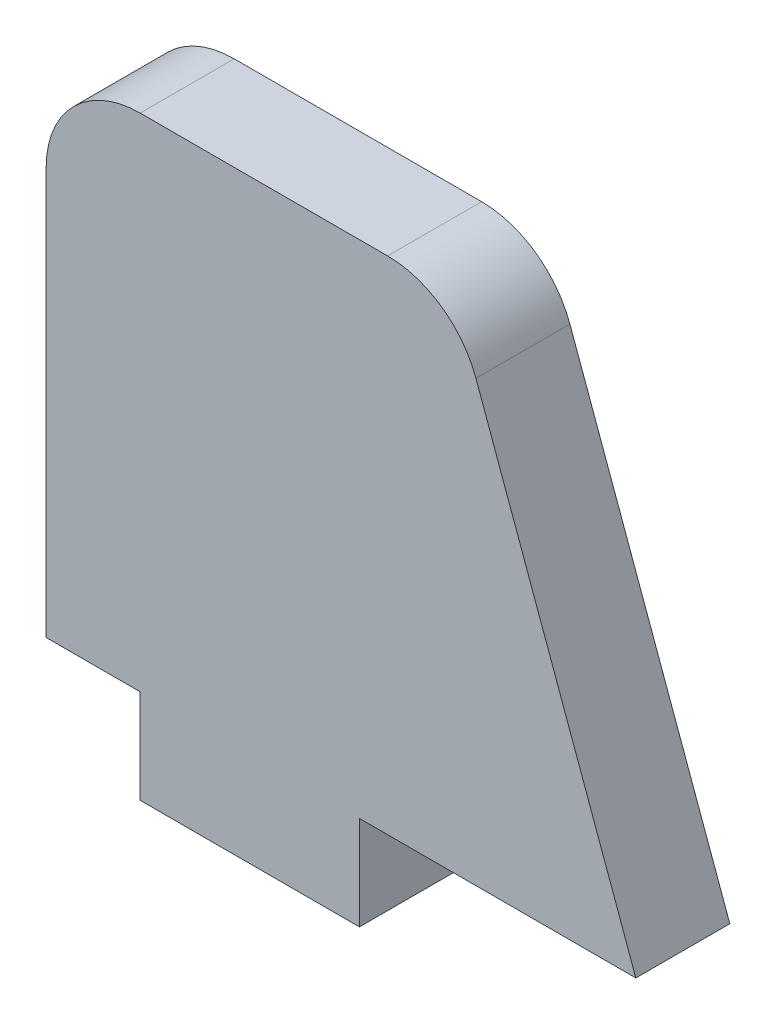
ISO-10303-21;
HEADER;
FILE_DESCRIPTION(('STEP AP214'),'2;1');
FILE_NAME('part.step','',(''),(''),'','','');
FILE_SCHEMA(('AUTOMOTIVE_DESIGN { 1 0 10303 214 1 1 1 1 }'));
ENDSEC;
DATA;
#1=APPLICATION_CONTEXT('core data for automotive mechanical design processes');
#2=APPLICATION_PROTOCOL_DEFINITION('international standard','automotive_design',2000,#1);
#3=PRODUCT_CONTEXT('',#1,'mechanical');
#4=PRODUCT('Part','Part','',(#3));
#5=PRODUCT_RELATED_PRODUCT_CATEGORY('part','',(#4));
#6=PRODUCT_DEFINITION_FORMATION('','',#4);
#7=PRODUCT_DEFINITION_CONTEXT('part definition',#1,'design');
#8=PRODUCT_DEFINITION('design','',#6,#7);
#9=PRODUCT_DEFINITION_SHAPE('','',#8);
#10=(LENGTH_UNIT() NAMED_UNIT(*) SI_UNIT(.MILLI.,.METRE.));
#11=(NAMED_UNIT(*) PLANE_ANGLE_UNIT() SI_UNIT($,.RADIAN.));
#12=(NAMED_UNIT(*) SI_UNIT($,.STERADIAN.) SOLID_ANGLE_UNIT());
#13=UNCERTAINTY_MEASURE_WITH_UNIT(LENGTH_MEASURE(1.E-05),#10,'distance_accuracy_value','');
#14=(GEOMETRIC_REPRESENTATION_CONTEXT(3) GLOBAL_UNCERTAINTY_ASSIGNED_CONTEXT((#13)) GLOBAL_UNIT_ASSIGNED_CONTEXT((#10,
#11,#12)) REPRESENTATION_CONTEXT('',''));
#15=CARTESIAN_POINT('',(0.,0.,0.));
#16=DIRECTION('',(0.,0.,1.));
#17=DIRECTION('',(1.,0.,0.));
#18=AXIS2_PLACEMENT_3D('',#15,#16,#17);
#19=CARTESIAN_POINT('',(-3.5,-8.,1.5));
#20=DIRECTION('',(0.,1.,0.));
#21=DIRECTION('',(-1.,0.,0.));
#22=AXIS2_PLACEMENT_3D('',#19,#20,#21);
#23=PLANE('',#22);
#24=DIRECTION('',(1.,0.,0.));
#25=VECTOR('',#24,1.);
#26=CARTESIAN_POINT('',(-3.5,-8.,-1.5));
#27=LINE('',#26,#25);
#28=CARTESIAN_POINT('',(-6.5,-8.,-1.5));
#29=VERTEX_POINT('',#28);
#30=CARTESIAN_POINT('',(-3.5,-8.,-1.5));
#31=VERTEX_POINT('',#30);
#32=EDGE_CURVE('E149',#29,#31,#27,.T.);
#33=ORIENTED_EDGE('',*,*,#32,.T.);
#34=DIRECTION('',(0.,0.,-1.));
#35=VECTOR('',#34,1.);
#36=CARTESIAN_POINT('',(-3.5,-8.,1.5));
#37=LINE('',#36,#35);
#38=CARTESIAN_POINT('',(-3.5,-8.,1.5));
#39=VERTEX_POINT('',#38);
#40=EDGE_CURVE('E130',#39,#31,#37,.T.);
#41=ORIENTED_EDGE('',*,*,#40,.F.);
#42=DIRECTION('',(1.,0.,0.));
#43=VECTOR('',#42,1.);
#44=CARTESIAN_POINT('',(-3.5,-8.,1.5));
#45=LINE('',#44,#43);
#46=CARTESIAN_POINT('',(-6.5,-8.,1.5));
#47=VERTEX_POINT('',#46);
#48=EDGE_CURVE('E137',#47,#39,#45,.T.);
#49=ORIENTED_EDGE('',*,*,#48,.F.);
#50=DIRECTION('',(0.,0.,-1.));
#51=VECTOR('',#50,1.);
#52=CARTESIAN_POINT('',(-6.5,-8.,1.5));
#53=LINE('',#52,#51);
#54=EDGE_CURVE('E210',#47,#29,#53,.T.);
#55=ORIENTED_EDGE('',*,*,#54,.T.);
#56=EDGE_LOOP('',(#33,#41,#49,#55));
#57=FACE_BOUND('',#56,.T.);
#58=ADVANCED_FACE('F45',(#57),#23,.F.);
#59=CARTESIAN_POINT('',(-3.5,-8.,1.5));
#60=DIRECTION('',(1.,0.,0.));
#61=DIRECTION('',(0.,1.,0.));
#62=AXIS2_PLACEMENT_3D('',#59,#60,#61);
#63=PLANE('',#62);
#64=DIRECTION('',(0.,-1.,0.));
#65=VECTOR('',#64,1.);
#66=CARTESIAN_POINT('',(-3.5,-8.,-1.5));
#67=LINE('',#66,#65);
#68=CARTESIAN_POINT('',(-3.5,-11.,-1.5));
#69=VERTEX_POINT('',#68);
#70=EDGE_CURVE('E232',#31,#69,#67,.T.);
#71=ORIENTED_EDGE('',*,*,#70,.T.);
#72=DIRECTION('',(0.,0.,-1.));
#73=VECTOR('',#72,1.);
#74=CARTESIAN_POINT('',(-3.5,-11.,1.5));
#75=LINE('',#74,#73);
#76=CARTESIAN_POINT('',(-3.5,-11.,1.5));
#77=VERTEX_POINT('',#76);
#78=EDGE_CURVE('E133',#77,#69,#75,.T.);
#79=ORIENTED_EDGE('',*,*,#78,.F.);
#80=DIRECTION('',(0.,-1.,0.));
#81=VECTOR('',#80,1.);
#82=CARTESIAN_POINT('',(-3.5,-8.,1.5));
#83=LINE('',#82,#81);
#84=EDGE_CURVE('E126',#39,#77,#83,.T.);
#85=ORIENTED_EDGE('',*,*,#84,.F.);
#86=ORIENTED_EDGE('',*,*,#40,.T.);
#87=EDGE_LOOP('',(#71,#79,#85,#86));
#88=FACE_BOUND('',#87,.T.);
#89=ADVANCED_FACE('F128',(#88),#63,.F.);
#90=CARTESIAN_POINT('',(-3.5,-11.,1.5));
#91=DIRECTION('',(0.,1.,0.));
#92=DIRECTION('',(0.,0.,1.));
#93=AXIS2_PLACEMENT_3D('',#90,#91,#92);
#94=PLANE('',#93);
#95=DIRECTION('',(1.,0.,0.));
#96=VECTOR('',#95,1.);
#97=CARTESIAN_POINT('',(-3.5,-11.,-1.5));
#98=LINE('',#97,#96);
#99=CARTESIAN_POINT('',(3.5,-11.,-1.5));
#100=VERTEX_POINT('',#99);
#101=EDGE_CURVE('E229',#69,#100,#98,.T.);
#102=ORIENTED_EDGE('',*,*,#101,.T.);
#103=DIRECTION('',(0.,0.,-1.));
#104=VECTOR('',#103,1.);
#105=CARTESIAN_POINT('',(3.5,-11.,1.5));
#106=LINE('',#105,#104);
#107=CARTESIAN_POINT('',(3.5,-11.,1.5));
#108=VERTEX_POINT('',#107);
#109=EDGE_CURVE('E157',#108,#100,#106,.T.);
#110=ORIENTED_EDGE('',*,*,#109,.F.);
#111=DIRECTION('',(1.,0.,0.));
#112=VECTOR('',#111,1.);
#113=CARTESIAN_POINT('',(-3.5,-11.,1.5));
#114=LINE('',#113,#112);
#115=EDGE_CURVE('E136',#77,#108,#114,.T.);
#116=ORIENTED_EDGE('',*,*,#115,.F.);
#117=ORIENTED_EDGE('',*,*,#78,.T.);
#118=EDGE_LOOP('',(#102,#110,#116,#117));
#119=FACE_BOUND('',#118,.T.);
#120=ADVANCED_FACE('F249',(#119),#94,.F.);
#121=CARTESIAN_POINT('',(3.5,-11.,1.5));
#122=DIRECTION('',(-1.,0.,0.));
#123=DIRECTION('',(0.,-1.,0.));
#124=AXIS2_PLACEMENT_3D('',#121,#122,#123);
#125=PLANE('',#124);
#126=DIRECTION('',(0.,1.,0.));
#127=VECTOR('',#126,1.);
#128=CARTESIAN_POINT('',(3.5,-11.,-1.5));
#129=LINE('',#128,#127);
#130=CARTESIAN_POINT('',(3.5,-8.,-1.5));
#131=VERTEX_POINT('',#130);
#132=EDGE_CURVE('E204',#100,#131,#129,.T.);
#133=ORIENTED_EDGE('',*,*,#132,.T.);
#134=DIRECTION('',(0.,0.,-1.));
#135=VECTOR('',#134,1.);
#136=CARTESIAN_POINT('',(3.5,-8.,1.5));
#137=LINE('',#136,#135);
#138=CARTESIAN_POINT('',(3.5,-8.,1.5));
#139=VERTEX_POINT('',#138);
#140=EDGE_CURVE('E215',#139,#131,#137,.T.);
#141=ORIENTED_EDGE('',*,*,#140,.F.);
#142=DIRECTION('',(0.,1.,0.));
#143=VECTOR('',#142,1.);
#144=CARTESIAN_POINT('',(3.5,-11.,1.5));
#145=LINE('',#144,#143);
#146=EDGE_CURVE('E226',#108,#139,#145,.T.);
#147=ORIENTED_EDGE('',*,*,#146,.F.);
#148=ORIENTED_EDGE('',*,*,#109,.T.);
#149=EDGE_LOOP('',(#133,#141,#147,#148));
#150=FACE_BOUND('',#149,.T.);
#151=ADVANCED_FACE('F224',(#150),#125,.F.);
#152=CARTESIAN_POINT('',(12.3235237482593,-8.,1.5));
#153=DIRECTION('',(0.,1.,0.));
#154=DIRECTION('',(-1.,0.,0.));
#155=AXIS2_PLACEMENT_3D('',#152,#153,#154);
#156=PLANE('',#155);
#157=DIRECTION('',(1.,0.,0.));
#158=VECTOR('',#157,1.);
#159=CARTESIAN_POINT('',(12.3235237482593,-8.,-1.5));
#160=LINE('',#159,#158);
#161=CARTESIAN_POINT('',(12.3235237482593,-8.,-1.5));
#162=VERTEX_POINT('',#161);
#163=EDGE_CURVE('E199',#131,#162,#160,.T.);
#164=ORIENTED_EDGE('',*,*,#163,.T.);
#165=DIRECTION('',(0.,0.,-1.));
#166=VECTOR('',#165,1.);
#167=CARTESIAN_POINT('',(12.3235237482593,-8.,1.5));
#168=LINE('',#167,#166);
#169=CARTESIAN_POINT('',(12.3235237482593,-8.,1.5));
#170=VERTEX_POINT('',#169);
#171=EDGE_CURVE('E197',#170,#162,#168,.T.);
#172=ORIENTED_EDGE('',*,*,#171,.F.);
#173=DIRECTION('',(1.,0.,0.));
#174=VECTOR('',#173,1.);
#175=CARTESIAN_POINT('',(12.3235237482593,-8.,1.5));
#176=LINE('',#175,#174);
#177=EDGE_CURVE('E243',#139,#170,#176,.T.);
#178=ORIENTED_EDGE('',*,*,#177,.F.);
#179=ORIENTED_EDGE('',*,*,#140,.T.);
#180=EDGE_LOOP('',(#164,#172,#178,#179));
#181=FACE_BOUND('',#180,.T.);
#182=ADVANCED_FACE('F256',(#181),#156,.F.);
#183=CARTESIAN_POINT('',(6.5,8.,1.5));
#184=DIRECTION('',(-0.939692620785907,-0.342020143325673,0.));
#185=DIRECTION('',(0.342020143325673,-0.939692620785907,0.));
#186=AXIS2_PLACEMENT_3D('',#183,#184,#185);
#187=PLANE('',#186);
#188=DIRECTION('',(-0.342020143325673,0.939692620785907,0.));
#189=VECTOR('',#188,1.);
#190=CARTESIAN_POINT('',(6.5,8.,-1.5));
#191=LINE('',#190,#189);
#192=CARTESIAN_POINT('',(7.2184552477286,6.02606042997702,-1.5));
#193=VERTEX_POINT('',#192);
#194=EDGE_CURVE('E192',#162,#193,#191,.T.);
#195=ORIENTED_EDGE('',*,*,#194,.T.);
#196=DIRECTION('',(0.,0.,-1.));
#197=VECTOR('',#196,1.);
#198=CARTESIAN_POINT('',(7.2184552477286,6.02606042997702,1.5));
#199=LINE('',#198,#197);
#200=CARTESIAN_POINT('',(7.2184552477286,6.02606042997702,1.5));
#201=VERTEX_POINT('',#200);
#202=EDGE_CURVE('E69',#193,#201,#199,.F.);
#203=ORIENTED_EDGE('',*,*,#202,.T.);
#204=DIRECTION('',(-0.342020143325673,0.939692620785907,0.));
#205=VECTOR('',#204,1.);
#206=CARTESIAN_POINT('',(6.5,8.,1.5));
#207=LINE('',#206,#205);
#208=EDGE_CURVE('E177',#170,#201,#207,.T.);
#209=ORIENTED_EDGE('',*,*,#208,.F.);
#210=ORIENTED_EDGE('',*,*,#171,.T.);
#211=EDGE_LOOP('',(#195,#203,#209,#210));
#212=FACE_BOUND('',#211,.T.);
#213=ADVANCED_FACE('F195',(#212),#187,.F.);
#214=CARTESIAN_POINT('',(-6.5,8.,1.5));
#215=DIRECTION('',(0.,-1.,0.));
#216=DIRECTION('',(0.,0.,-1.));
#217=AXIS2_PLACEMENT_3D('',#214,#215,#216);
#218=PLANE('',#217);
#219=DIRECTION('',(-1.,0.,0.));
#220=VECTOR('',#219,1.);
#221=CARTESIAN_POINT('',(-6.5,8.,1.5));
#222=LINE('',#221,#220);
#223=CARTESIAN_POINT('',(4.39937738537088,8.,1.5));
#224=VERTEX_POINT('',#223);
#225=CARTESIAN_POINT('',(-3.5,8.,1.5));
#226=VERTEX_POINT('',#225);
#227=EDGE_CURVE('E176',#224,#226,#222,.T.);
#228=ORIENTED_EDGE('',*,*,#227,.F.);
#229=DIRECTION('',(0.,0.,-1.));
#230=VECTOR('',#229,1.);
#231=CARTESIAN_POINT('',(4.39937738537088,8.,1.5));
#232=LINE('',#231,#230);
#233=CARTESIAN_POINT('',(4.39937738537088,8.,-1.5));
#234=VERTEX_POINT('',#233);
#235=EDGE_CURVE('E155',#224,#234,#232,.T.);
#236=ORIENTED_EDGE('',*,*,#235,.T.);
#237=DIRECTION('',(-1.,0.,0.));
#238=VECTOR('',#237,1.);
#239=CARTESIAN_POINT('',(-6.5,8.,-1.5));
#240=LINE('',#239,#238);
#241=CARTESIAN_POINT('',(-3.5,8.,-1.5));
#242=VERTEX_POINT('',#241);
#243=EDGE_CURVE('E193',#234,#242,#240,.T.);
#244=ORIENTED_EDGE('',*,*,#243,.T.);
#245=DIRECTION('',(0.,0.,-1.));
#246=VECTOR('',#245,1.);
#247=CARTESIAN_POINT('',(-3.5,8.,1.5));
#248=LINE('',#247,#246);
#249=EDGE_CURVE('E151',#242,#226,#248,.F.);
#250=ORIENTED_EDGE('',*,*,#249,.T.);
#251=EDGE_LOOP('',(#228,#236,#244,#250));
#252=FACE_BOUND('',#251,.T.);
#253=ADVANCED_FACE('F181',(#252),#218,.F.);
#254=CARTESIAN_POINT('',(-6.5,-8.,1.5));
#255=DIRECTION('',(1.,0.,0.));
#256=DIRECTION('',(0.,0.,-1.));
#257=AXIS2_PLACEMENT_3D('',#254,#255,#256);
#258=PLANE('',#257);
#259=DIRECTION('',(0.,-1.,0.));
#260=VECTOR('',#259,1.);
#261=CARTESIAN_POINT('',(-6.5,-8.,1.5));
#262=LINE('',#261,#260);
#263=CARTESIAN_POINT('',(-6.5,5.,1.5));
#264=VERTEX_POINT('',#263);
#265=EDGE_CURVE('E141',#264,#47,#262,.T.);
#266=ORIENTED_EDGE('',*,*,#265,.F.);
#267=DIRECTION('',(0.,0.,-1.));
#268=VECTOR('',#267,1.);
#269=CARTESIAN_POINT('',(-6.5,5.,1.5));
#270=LINE('',#269,#268);
#271=CARTESIAN_POINT('',(-6.5,5.,-1.5));
#272=VERTEX_POINT('',#271);
#273=EDGE_CURVE('E11',#264,#272,#270,.T.);
#274=ORIENTED_EDGE('',*,*,#273,.T.);
#275=DIRECTION('',(0.,-1.,0.));
#276=VECTOR('',#275,1.);
#277=CARTESIAN_POINT('',(-6.5,-8.,-1.5));
#278=LINE('',#277,#276);
#279=EDGE_CURVE('E146',#272,#29,#278,.T.);
#280=ORIENTED_EDGE('',*,*,#279,.T.);
#281=ORIENTED_EDGE('',*,*,#54,.F.);
#282=EDGE_LOOP('',(#266,#274,#280,#281));
#283=FACE_BOUND('',#282,.T.);
#284=ADVANCED_FACE('F273',(#283),#258,.F.);
#285=CARTESIAN_POINT('',(0.,0.,1.5));
#286=DIRECTION('',(0.,0.,-1.));
#287=DIRECTION('',(-1.,0.,0.));
#288=AXIS2_PLACEMENT_3D('',#285,#286,#287);
#289=PLANE('',#288);
#290=ORIENTED_EDGE('',*,*,#208,.T.);
#291=CARTESIAN_POINT('',(4.39937738537088,5.,1.5));
#292=DIRECTION('',(0.,0.,-1.));
#293=DIRECTION('',(-1.,0.,0.));
#294=AXIS2_PLACEMENT_3D('',#291,#292,#293);
#295=CIRCLE('',#294,3.);
#296=EDGE_CURVE('E54',#201,#224,#295,.F.);
#297=ORIENTED_EDGE('',*,*,#296,.T.);
#298=ORIENTED_EDGE('',*,*,#227,.T.);
#299=CARTESIAN_POINT('',(-3.5,5.,1.5));
#300=DIRECTION('',(0.,0.,-1.));
#301=DIRECTION('',(-1.,0.,0.));
#302=AXIS2_PLACEMENT_3D('',#299,#300,#301);
#303=CIRCLE('',#302,3.);
#304=EDGE_CURVE('E61',#226,#264,#303,.F.);
#305=ORIENTED_EDGE('',*,*,#304,.T.);
#306=ORIENTED_EDGE('',*,*,#265,.T.);
#307=ORIENTED_EDGE('',*,*,#48,.T.);
#308=ORIENTED_EDGE('',*,*,#84,.T.);
#309=ORIENTED_EDGE('',*,*,#115,.T.);
#310=ORIENTED_EDGE('',*,*,#146,.T.);
#311=ORIENTED_EDGE('',*,*,#177,.T.);
#312=EDGE_LOOP('',(#290,#297,#298,#305,#306,#307,#308,#309,#310,#311));
#313=FACE_BOUND('',#312,.T.);
#314=ADVANCED_FACE('F140',(#313),#289,.F.);
#315=CARTESIAN_POINT('',(0.,0.,-1.5));
#316=DIRECTION('',(0.,0.,-1.));
#317=DIRECTION('',(-1.,0.,0.));
#318=AXIS2_PLACEMENT_3D('',#315,#316,#317);
#319=PLANE('',#318);
#320=ORIENTED_EDGE('',*,*,#243,.F.);
#321=CARTESIAN_POINT('',(4.39937738537088,5.,-1.5));
#322=DIRECTION('',(0.,0.,-1.));
#323=DIRECTION('',(-1.,0.,0.));
#324=AXIS2_PLACEMENT_3D('',#321,#322,#323);
#325=CIRCLE('',#324,3.);
#326=EDGE_CURVE('E167',#234,#193,#325,.T.);
#327=ORIENTED_EDGE('',*,*,#326,.T.);
#328=ORIENTED_EDGE('',*,*,#194,.F.);
#329=ORIENTED_EDGE('',*,*,#163,.F.);
#330=ORIENTED_EDGE('',*,*,#132,.F.);
#331=ORIENTED_EDGE('',*,*,#101,.F.);
#332=ORIENTED_EDGE('',*,*,#70,.F.);
#333=ORIENTED_EDGE('',*,*,#32,.F.);
#334=ORIENTED_EDGE('',*,*,#279,.F.);
#335=CARTESIAN_POINT('',(-3.5,5.,-1.5));
#336=DIRECTION('',(0.,0.,-1.));
#337=DIRECTION('',(-1.,0.,0.));
#338=AXIS2_PLACEMENT_3D('',#335,#336,#337);
#339=CIRCLE('',#338,3.);
#340=EDGE_CURVE('E164',#272,#242,#339,.T.);
#341=ORIENTED_EDGE('',*,*,#340,.T.);
#342=EDGE_LOOP('',(#320,#327,#328,#329,#330,#331,#332,#333,#334,#341));
#343=FACE_BOUND('',#342,.T.);
#344=ADVANCED_FACE('F190',(#343),#319,.T.);
#345=CARTESIAN_POINT('',(4.39937738537088,5.,1.5));
#346=DIRECTION('',(0.,0.,-1.));
#347=DIRECTION('',(-1.,0.,0.));
#348=AXIS2_PLACEMENT_3D('',#345,#346,#347);
#349=CYLINDRICAL_SURFACE('',#348,3.);
#350=ORIENTED_EDGE('',*,*,#296,.F.);
#351=ORIENTED_EDGE('',*,*,#202,.F.);
#352=ORIENTED_EDGE('',*,*,#326,.F.);
#353=ORIENTED_EDGE('',*,*,#235,.F.);
#354=EDGE_LOOP('',(#350,#351,#352,#353));
#355=FACE_BOUND('',#354,.T.);
#356=ADVANCED_FACE('F187',(#355),#349,.T.);
#357=CARTESIAN_POINT('',(-3.5,5.,1.5));
#358=DIRECTION('',(0.,0.,-1.));
#359=DIRECTION('',(-1.,0.,0.));
#360=AXIS2_PLACEMENT_3D('',#357,#358,#359);
#361=CYLINDRICAL_SURFACE('',#360,3.);
#362=ORIENTED_EDGE('',*,*,#304,.F.);
#363=ORIENTED_EDGE('',*,*,#249,.F.);
#364=ORIENTED_EDGE('',*,*,#340,.F.);
#365=ORIENTED_EDGE('',*,*,#273,.F.);
#366=EDGE_LOOP('',(#362,#363,#364,#365));
#367=FACE_BOUND('',#366,.T.);
#368=ADVANCED_FACE('F47',(#367),#361,.T.);
#369=CLOSED_SHELL('',(#58,#89,#120,#151,#182,#213,#253,#284,#314,#344,#356,#368));
#370=MANIFOLD_SOLID_BREP('B2',#369);
#371=ADVANCED_BREP_SHAPE_REPRESENTATION('',(#18,#370),#14);
#372=SHAPE_DEFINITION_REPRESENTATION(#9,#371);
ENDSEC;
END-ISO-10303-21;
